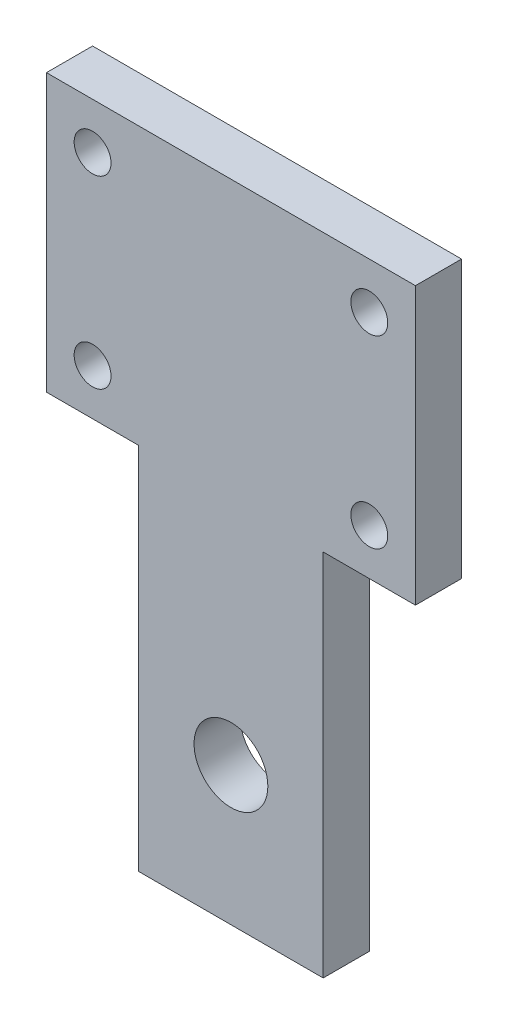
ISO-10303-21;
HEADER;
FILE_DESCRIPTION(('STEP AP214'),'2;1');
FILE_NAME('part.step','',(''),(''),'','','');
FILE_SCHEMA(('AUTOMOTIVE_DESIGN { 1 0 10303 214 1 1 1 1 }'));
ENDSEC;
DATA;
#1=APPLICATION_CONTEXT('core data for automotive mechanical design processes');
#2=APPLICATION_PROTOCOL_DEFINITION('international standard','automotive_design',2000,#1);
#3=PRODUCT_CONTEXT('',#1,'mechanical');
#4=PRODUCT('Part','Part','',(#3));
#5=PRODUCT_RELATED_PRODUCT_CATEGORY('part','',(#4));
#6=PRODUCT_DEFINITION_FORMATION('','',#4);
#7=PRODUCT_DEFINITION_CONTEXT('part definition',#1,'design');
#8=PRODUCT_DEFINITION('design','',#6,#7);
#9=PRODUCT_DEFINITION_SHAPE('','',#8);
#10=(LENGTH_UNIT() NAMED_UNIT(*) SI_UNIT(.MILLI.,.METRE.));
#11=(NAMED_UNIT(*) PLANE_ANGLE_UNIT() SI_UNIT($,.RADIAN.));
#12=(NAMED_UNIT(*) SI_UNIT($,.STERADIAN.) SOLID_ANGLE_UNIT());
#13=UNCERTAINTY_MEASURE_WITH_UNIT(LENGTH_MEASURE(1.E-05),#10,'distance_accuracy_value','');
#14=(GEOMETRIC_REPRESENTATION_CONTEXT(3) GLOBAL_UNCERTAINTY_ASSIGNED_CONTEXT((#13)) GLOBAL_UNIT_ASSIGNED_CONTEXT((#10,
#11,#12)) REPRESENTATION_CONTEXT('',''));
#15=CARTESIAN_POINT('',(0.,0.,0.));
#16=DIRECTION('',(0.,0.,1.));
#17=DIRECTION('',(1.,0.,0.));
#18=AXIS2_PLACEMENT_3D('',#15,#16,#17);
#19=CARTESIAN_POINT('',(20.,30.,2.5));
#20=DIRECTION('',(0.,-1.,0.));
#21=DIRECTION('',(1.,0.,0.));
#22=AXIS2_PLACEMENT_3D('',#19,#20,#21);
#23=PLANE('',#22);
#24=DIRECTION('',(-1.,0.,0.));
#25=VECTOR('',#24,1.);
#26=CARTESIAN_POINT('',(20.,30.,-2.5));
#27=LINE('',#26,#25);
#28=CARTESIAN_POINT('',(20.,30.,-2.5));
#29=VERTEX_POINT('',#28);
#30=CARTESIAN_POINT('',(-20.,30.,-2.5));
#31=VERTEX_POINT('',#30);
#32=EDGE_CURVE('E130',#29,#31,#27,.T.);
#33=ORIENTED_EDGE('',*,*,#32,.T.);
#34=DIRECTION('',(0.,0.,-1.));
#35=VECTOR('',#34,1.);
#36=CARTESIAN_POINT('',(-20.,30.,2.5));
#37=LINE('',#36,#35);
#38=CARTESIAN_POINT('',(-20.,30.,2.5));
#39=VERTEX_POINT('',#38);
#40=EDGE_CURVE('E11',#39,#31,#37,.T.);
#41=ORIENTED_EDGE('',*,*,#40,.F.);
#42=DIRECTION('',(-1.,0.,0.));
#43=VECTOR('',#42,1.);
#44=CARTESIAN_POINT('',(20.,30.,2.5));
#45=LINE('',#44,#43);
#46=CARTESIAN_POINT('',(20.,30.,2.5));
#47=VERTEX_POINT('',#46);
#48=EDGE_CURVE('E145',#47,#39,#45,.T.);
#49=ORIENTED_EDGE('',*,*,#48,.F.);
#50=DIRECTION('',(0.,0.,-1.));
#51=VECTOR('',#50,1.);
#52=CARTESIAN_POINT('',(20.,30.,2.5));
#53=LINE('',#52,#51);
#54=EDGE_CURVE('E126',#47,#29,#53,.T.);
#55=ORIENTED_EDGE('',*,*,#54,.T.);
#56=EDGE_LOOP('',(#33,#41,#49,#55));
#57=FACE_BOUND('',#56,.T.);
#58=ADVANCED_FACE('F32',(#57),#23,.F.);
#59=CARTESIAN_POINT('',(-20.,30.,2.5));
#60=DIRECTION('',(1.,0.,0.));
#61=DIRECTION('',(0.,1.,0.));
#62=AXIS2_PLACEMENT_3D('',#59,#60,#61);
#63=PLANE('',#62);
#64=DIRECTION('',(0.,-1.,0.));
#65=VECTOR('',#64,1.);
#66=CARTESIAN_POINT('',(-20.,30.,-2.5));
#67=LINE('',#66,#65);
#68=CARTESIAN_POINT('',(-20.,0.,-2.5));
#69=VERTEX_POINT('',#68);
#70=EDGE_CURVE('E133',#31,#69,#67,.T.);
#71=ORIENTED_EDGE('',*,*,#70,.T.);
#72=DIRECTION('',(0.,0.,-1.));
#73=VECTOR('',#72,1.);
#74=CARTESIAN_POINT('',(-20.,0.,2.5));
#75=LINE('',#74,#73);
#76=CARTESIAN_POINT('',(-20.,0.,2.5));
#77=VERTEX_POINT('',#76);
#78=EDGE_CURVE('E41',#77,#69,#75,.T.);
#79=ORIENTED_EDGE('',*,*,#78,.F.);
#80=DIRECTION('',(0.,-1.,0.));
#81=VECTOR('',#80,1.);
#82=CARTESIAN_POINT('',(-20.,30.,2.5));
#83=LINE('',#82,#81);
#84=EDGE_CURVE('E93',#39,#77,#83,.T.);
#85=ORIENTED_EDGE('',*,*,#84,.F.);
#86=ORIENTED_EDGE('',*,*,#40,.T.);
#87=EDGE_LOOP('',(#71,#79,#85,#86));
#88=FACE_BOUND('',#87,.T.);
#89=ADVANCED_FACE('F220',(#88),#63,.F.);
#90=CARTESIAN_POINT('',(-20.,0.,2.5));
#91=DIRECTION('',(0.,1.,0.));
#92=DIRECTION('',(-1.,0.,0.));
#93=AXIS2_PLACEMENT_3D('',#90,#91,#92);
#94=PLANE('',#93);
#95=DIRECTION('',(1.,0.,0.));
#96=VECTOR('',#95,1.);
#97=CARTESIAN_POINT('',(-20.,0.,-2.5));
#98=LINE('',#97,#96);
#99=CARTESIAN_POINT('',(-9.99999999999998,0.,-2.5));
#100=VERTEX_POINT('',#99);
#101=EDGE_CURVE('E136',#69,#100,#98,.T.);
#102=ORIENTED_EDGE('',*,*,#101,.T.);
#103=DIRECTION('',(0.,0.,-1.));
#104=VECTOR('',#103,1.);
#105=CARTESIAN_POINT('',(-9.99999999999998,0.,2.5));
#106=LINE('',#105,#104);
#107=CARTESIAN_POINT('',(-9.99999999999998,0.,2.5));
#108=VERTEX_POINT('',#107);
#109=EDGE_CURVE('E152',#108,#100,#106,.T.);
#110=ORIENTED_EDGE('',*,*,#109,.F.);
#111=DIRECTION('',(1.,0.,0.));
#112=VECTOR('',#111,1.);
#113=CARTESIAN_POINT('',(-20.,0.,2.5));
#114=LINE('',#113,#112);
#115=EDGE_CURVE('E188',#77,#108,#114,.T.);
#116=ORIENTED_EDGE('',*,*,#115,.F.);
#117=ORIENTED_EDGE('',*,*,#78,.T.);
#118=EDGE_LOOP('',(#102,#110,#116,#117));
#119=FACE_BOUND('',#118,.T.);
#120=ADVANCED_FACE('F224',(#119),#94,.F.);
#121=CARTESIAN_POINT('',(-9.99999999999998,0.,2.5));
#122=DIRECTION('',(1.,0.,0.));
#123=DIRECTION('',(0.,1.,0.));
#124=AXIS2_PLACEMENT_3D('',#121,#122,#123);
#125=PLANE('',#124);
#126=DIRECTION('',(0.,-1.,0.));
#127=VECTOR('',#126,1.);
#128=CARTESIAN_POINT('',(-9.99999999999998,0.,-2.5));
#129=LINE('',#128,#127);
#130=CARTESIAN_POINT('',(-9.99999999999999,-40.,-2.5));
#131=VERTEX_POINT('',#130);
#132=EDGE_CURVE('E138',#100,#131,#129,.T.);
#133=ORIENTED_EDGE('',*,*,#132,.T.);
#134=DIRECTION('',(0.,0.,-1.));
#135=VECTOR('',#134,1.);
#136=CARTESIAN_POINT('',(-9.99999999999999,-40.,2.5));
#137=LINE('',#136,#135);
#138=CARTESIAN_POINT('',(-9.99999999999999,-40.,2.5));
#139=VERTEX_POINT('',#138);
#140=EDGE_CURVE('E149',#139,#131,#137,.T.);
#141=ORIENTED_EDGE('',*,*,#140,.F.);
#142=DIRECTION('',(0.,-1.,0.));
#143=VECTOR('',#142,1.);
#144=CARTESIAN_POINT('',(-9.99999999999998,0.,2.5));
#145=LINE('',#144,#143);
#146=EDGE_CURVE('E190',#108,#139,#145,.T.);
#147=ORIENTED_EDGE('',*,*,#146,.F.);
#148=ORIENTED_EDGE('',*,*,#109,.T.);
#149=EDGE_LOOP('',(#133,#141,#147,#148));
#150=FACE_BOUND('',#149,.T.);
#151=ADVANCED_FACE('F196',(#150),#125,.F.);
#152=CARTESIAN_POINT('',(-9.99999999999999,-40.,2.5));
#153=DIRECTION('',(0.,1.,0.));
#154=DIRECTION('',(-1.,0.,0.));
#155=AXIS2_PLACEMENT_3D('',#152,#153,#154);
#156=PLANE('',#155);
#157=DIRECTION('',(1.,0.,0.));
#158=VECTOR('',#157,1.);
#159=CARTESIAN_POINT('',(-9.99999999999999,-40.,-2.5));
#160=LINE('',#159,#158);
#161=CARTESIAN_POINT('',(10.,-40.,-2.5));
#162=VERTEX_POINT('',#161);
#163=EDGE_CURVE('E140',#131,#162,#160,.T.);
#164=ORIENTED_EDGE('',*,*,#163,.T.);
#165=DIRECTION('',(0.,0.,-1.));
#166=VECTOR('',#165,1.);
#167=CARTESIAN_POINT('',(10.,-40.,2.5));
#168=LINE('',#167,#166);
#169=CARTESIAN_POINT('',(10.,-40.,2.5));
#170=VERTEX_POINT('',#169);
#171=EDGE_CURVE('E121',#170,#162,#168,.T.);
#172=ORIENTED_EDGE('',*,*,#171,.F.);
#173=DIRECTION('',(1.,0.,0.));
#174=VECTOR('',#173,1.);
#175=CARTESIAN_POINT('',(-9.99999999999999,-40.,2.5));
#176=LINE('',#175,#174);
#177=EDGE_CURVE('E112',#139,#170,#176,.T.);
#178=ORIENTED_EDGE('',*,*,#177,.F.);
#179=ORIENTED_EDGE('',*,*,#140,.T.);
#180=EDGE_LOOP('',(#164,#172,#178,#179));
#181=FACE_BOUND('',#180,.T.);
#182=ADVANCED_FACE('F200',(#181),#156,.F.);
#183=CARTESIAN_POINT('',(10.,-40.,2.5));
#184=DIRECTION('',(-1.,0.,0.));
#185=DIRECTION('',(0.,-1.,0.));
#186=AXIS2_PLACEMENT_3D('',#183,#184,#185);
#187=PLANE('',#186);
#188=DIRECTION('',(0.,1.,0.));
#189=VECTOR('',#188,1.);
#190=CARTESIAN_POINT('',(10.,-40.,-2.5));
#191=LINE('',#190,#189);
#192=CARTESIAN_POINT('',(9.99999999999998,0.,-2.5));
#193=VERTEX_POINT('',#192);
#194=EDGE_CURVE('E120',#162,#193,#191,.T.);
#195=ORIENTED_EDGE('',*,*,#194,.T.);
#196=DIRECTION('',(0.,0.,-1.));
#197=VECTOR('',#196,1.);
#198=CARTESIAN_POINT('',(9.99999999999998,0.,2.5));
#199=LINE('',#198,#197);
#200=CARTESIAN_POINT('',(9.99999999999998,0.,2.5));
#201=VERTEX_POINT('',#200);
#202=EDGE_CURVE('E117',#201,#193,#199,.T.);
#203=ORIENTED_EDGE('',*,*,#202,.F.);
#204=DIRECTION('',(0.,1.,0.));
#205=VECTOR('',#204,1.);
#206=CARTESIAN_POINT('',(10.,-40.,2.5));
#207=LINE('',#206,#205);
#208=EDGE_CURVE('E106',#170,#201,#207,.T.);
#209=ORIENTED_EDGE('',*,*,#208,.F.);
#210=ORIENTED_EDGE('',*,*,#171,.T.);
#211=EDGE_LOOP('',(#195,#203,#209,#210));
#212=FACE_BOUND('',#211,.T.);
#213=ADVANCED_FACE('F118',(#212),#187,.F.);
#214=CARTESIAN_POINT('',(9.99999999999998,0.,2.5));
#215=DIRECTION('',(0.,1.,0.));
#216=DIRECTION('',(-1.,0.,0.));
#217=AXIS2_PLACEMENT_3D('',#214,#215,#216);
#218=PLANE('',#217);
#219=DIRECTION('',(1.,0.,0.));
#220=VECTOR('',#219,1.);
#221=CARTESIAN_POINT('',(9.99999999999998,0.,-2.5));
#222=LINE('',#221,#220);
#223=CARTESIAN_POINT('',(20.,0.,-2.5));
#224=VERTEX_POINT('',#223);
#225=EDGE_CURVE('E79',#193,#224,#222,.T.);
#226=ORIENTED_EDGE('',*,*,#225,.T.);
#227=DIRECTION('',(0.,0.,-1.));
#228=VECTOR('',#227,1.);
#229=CARTESIAN_POINT('',(20.,0.,2.5));
#230=LINE('',#229,#228);
#231=CARTESIAN_POINT('',(20.,0.,2.5));
#232=VERTEX_POINT('',#231);
#233=EDGE_CURVE('E122',#232,#224,#230,.T.);
#234=ORIENTED_EDGE('',*,*,#233,.F.);
#235=DIRECTION('',(1.,0.,0.));
#236=VECTOR('',#235,1.);
#237=CARTESIAN_POINT('',(9.99999999999998,0.,2.5));
#238=LINE('',#237,#236);
#239=EDGE_CURVE('E110',#201,#232,#238,.T.);
#240=ORIENTED_EDGE('',*,*,#239,.F.);
#241=ORIENTED_EDGE('',*,*,#202,.T.);
#242=EDGE_LOOP('',(#226,#234,#240,#241));
#243=FACE_BOUND('',#242,.T.);
#244=ADVANCED_FACE('F124',(#243),#218,.F.);
#245=CARTESIAN_POINT('',(20.,0.,2.5));
#246=DIRECTION('',(-1.,0.,0.));
#247=DIRECTION('',(0.,-1.,0.));
#248=AXIS2_PLACEMENT_3D('',#245,#246,#247);
#249=PLANE('',#248);
#250=DIRECTION('',(0.,1.,0.));
#251=VECTOR('',#250,1.);
#252=CARTESIAN_POINT('',(20.,0.,-2.5));
#253=LINE('',#252,#251);
#254=EDGE_CURVE('E85',#224,#29,#253,.T.);
#255=ORIENTED_EDGE('',*,*,#254,.T.);
#256=ORIENTED_EDGE('',*,*,#54,.F.);
#257=DIRECTION('',(0.,1.,0.));
#258=VECTOR('',#257,1.);
#259=CARTESIAN_POINT('',(20.,0.,2.5));
#260=LINE('',#259,#258);
#261=EDGE_CURVE('E50',#232,#47,#260,.T.);
#262=ORIENTED_EDGE('',*,*,#261,.F.);
#263=ORIENTED_EDGE('',*,*,#233,.T.);
#264=EDGE_LOOP('',(#255,#256,#262,#263));
#265=FACE_BOUND('',#264,.T.);
#266=ADVANCED_FACE('F208',(#265),#249,.F.);
#267=CARTESIAN_POINT('',(0.,0.,2.5));
#268=DIRECTION('',(0.,0.,1.));
#269=DIRECTION('',(1.,0.,0.));
#270=AXIS2_PLACEMENT_3D('',#267,#268,#269);
#271=PLANE('',#270);
#272=CARTESIAN_POINT('',(-15.,5.,2.5));
#273=DIRECTION('',(0.,0.,1.));
#274=DIRECTION('',(1.,0.,0.));
#275=AXIS2_PLACEMENT_3D('',#272,#273,#274);
#276=CIRCLE('',#275,2.);
#277=CARTESIAN_POINT('',(-13.,5.,2.5));
#278=VERTEX_POINT('',#277);
#279=EDGE_CURVE('E177',#278,#278,#276,.T.);
#280=ORIENTED_EDGE('',*,*,#279,.F.);
#281=EDGE_LOOP('',(#280));
#282=FACE_BOUND('',#281,.T.);
#283=CARTESIAN_POINT('',(15.,5.,2.5));
#284=DIRECTION('',(0.,0.,1.));
#285=DIRECTION('',(1.,0.,0.));
#286=AXIS2_PLACEMENT_3D('',#283,#284,#285);
#287=CIRCLE('',#286,2.00000000000001);
#288=CARTESIAN_POINT('',(17.,5.,2.5));
#289=VERTEX_POINT('',#288);
#290=EDGE_CURVE('E167',#289,#289,#287,.T.);
#291=ORIENTED_EDGE('',*,*,#290,.F.);
#292=EDGE_LOOP('',(#291));
#293=FACE_BOUND('',#292,.T.);
#294=CARTESIAN_POINT('',(15.,25.,2.5));
#295=DIRECTION('',(0.,0.,1.));
#296=DIRECTION('',(1.,0.,0.));
#297=AXIS2_PLACEMENT_3D('',#294,#295,#296);
#298=CIRCLE('',#297,2.00000000000001);
#299=CARTESIAN_POINT('',(17.,25.,2.5));
#300=VERTEX_POINT('',#299);
#301=EDGE_CURVE('E164',#300,#300,#298,.T.);
#302=ORIENTED_EDGE('',*,*,#301,.F.);
#303=EDGE_LOOP('',(#302));
#304=FACE_BOUND('',#303,.T.);
#305=CARTESIAN_POINT('',(-15.,25.,2.5));
#306=DIRECTION('',(0.,0.,1.));
#307=DIRECTION('',(1.,0.,0.));
#308=AXIS2_PLACEMENT_3D('',#305,#306,#307);
#309=CIRCLE('',#308,2.);
#310=CARTESIAN_POINT('',(-13.,25.,2.5));
#311=VERTEX_POINT('',#310);
#312=EDGE_CURVE('E161',#311,#311,#309,.T.);
#313=ORIENTED_EDGE('',*,*,#312,.F.);
#314=EDGE_LOOP('',(#313));
#315=FACE_BOUND('',#314,.T.);
#316=CARTESIAN_POINT('',(0.,-25.,2.5));
#317=DIRECTION('',(0.,0.,1.));
#318=DIRECTION('',(1.,0.,0.));
#319=AXIS2_PLACEMENT_3D('',#316,#317,#318);
#320=CIRCLE('',#319,4.);
#321=CARTESIAN_POINT('',(4.,-25.,2.5));
#322=VERTEX_POINT('',#321);
#323=EDGE_CURVE('E160',#322,#322,#320,.T.);
#324=ORIENTED_EDGE('',*,*,#323,.F.);
#325=EDGE_LOOP('',(#324));
#326=FACE_BOUND('',#325,.T.);
#327=ORIENTED_EDGE('',*,*,#48,.T.);
#328=ORIENTED_EDGE('',*,*,#84,.T.);
#329=ORIENTED_EDGE('',*,*,#115,.T.);
#330=ORIENTED_EDGE('',*,*,#146,.T.);
#331=ORIENTED_EDGE('',*,*,#177,.T.);
#332=ORIENTED_EDGE('',*,*,#208,.T.);
#333=ORIENTED_EDGE('',*,*,#239,.T.);
#334=ORIENTED_EDGE('',*,*,#261,.T.);
#335=EDGE_LOOP('',(#327,#328,#329,#330,#331,#332,#333,#334));
#336=FACE_BOUND('',#335,.T.);
#337=ADVANCED_FACE('F108',(#282,#293,#304,#315,#326,#336),#271,.T.);
#338=CARTESIAN_POINT('',(0.,0.,-2.5));
#339=DIRECTION('',(0.,0.,1.));
#340=DIRECTION('',(1.,0.,0.));
#341=AXIS2_PLACEMENT_3D('',#338,#339,#340);
#342=PLANE('',#341);
#343=CARTESIAN_POINT('',(-15.,5.,-2.5));
#344=DIRECTION('',(0.,0.,1.));
#345=DIRECTION('',(1.,0.,0.));
#346=AXIS2_PLACEMENT_3D('',#343,#344,#345);
#347=CIRCLE('',#346,2.);
#348=CARTESIAN_POINT('',(-13.,5.,-2.5));
#349=VERTEX_POINT('',#348);
#350=EDGE_CURVE('E35',#349,#349,#347,.T.);
#351=ORIENTED_EDGE('',*,*,#350,.T.);
#352=EDGE_LOOP('',(#351));
#353=FACE_BOUND('',#352,.T.);
#354=CARTESIAN_POINT('',(15.,5.,-2.5));
#355=DIRECTION('',(0.,0.,1.));
#356=DIRECTION('',(1.,0.,0.));
#357=AXIS2_PLACEMENT_3D('',#354,#355,#356);
#358=CIRCLE('',#357,2.00000000000001);
#359=CARTESIAN_POINT('',(17.,5.,-2.5));
#360=VERTEX_POINT('',#359);
#361=EDGE_CURVE('E165',#360,#360,#358,.T.);
#362=ORIENTED_EDGE('',*,*,#361,.T.);
#363=EDGE_LOOP('',(#362));
#364=FACE_BOUND('',#363,.T.);
#365=CARTESIAN_POINT('',(15.,25.,-2.5));
#366=DIRECTION('',(0.,0.,1.));
#367=DIRECTION('',(1.,0.,0.));
#368=AXIS2_PLACEMENT_3D('',#365,#366,#367);
#369=CIRCLE('',#368,2.00000000000001);
#370=CARTESIAN_POINT('',(17.,25.,-2.5));
#371=VERTEX_POINT('',#370);
#372=EDGE_CURVE('E162',#371,#371,#369,.T.);
#373=ORIENTED_EDGE('',*,*,#372,.T.);
#374=EDGE_LOOP('',(#373));
#375=FACE_BOUND('',#374,.T.);
#376=CARTESIAN_POINT('',(-15.,25.,-2.5));
#377=DIRECTION('',(0.,0.,1.));
#378=DIRECTION('',(1.,0.,0.));
#379=AXIS2_PLACEMENT_3D('',#376,#377,#378);
#380=CIRCLE('',#379,2.);
#381=CARTESIAN_POINT('',(-13.,25.,-2.5));
#382=VERTEX_POINT('',#381);
#383=EDGE_CURVE('E157',#382,#382,#380,.T.);
#384=ORIENTED_EDGE('',*,*,#383,.T.);
#385=EDGE_LOOP('',(#384));
#386=FACE_BOUND('',#385,.T.);
#387=CARTESIAN_POINT('',(0.,-25.,-2.5));
#388=DIRECTION('',(0.,0.,1.));
#389=DIRECTION('',(1.,0.,0.));
#390=AXIS2_PLACEMENT_3D('',#387,#388,#389);
#391=CIRCLE('',#390,4.);
#392=CARTESIAN_POINT('',(4.,-25.,-2.5));
#393=VERTEX_POINT('',#392);
#394=EDGE_CURVE('E134',#393,#393,#391,.T.);
#395=ORIENTED_EDGE('',*,*,#394,.T.);
#396=EDGE_LOOP('',(#395));
#397=FACE_BOUND('',#396,.T.);
#398=ORIENTED_EDGE('',*,*,#32,.F.);
#399=ORIENTED_EDGE('',*,*,#254,.F.);
#400=ORIENTED_EDGE('',*,*,#225,.F.);
#401=ORIENTED_EDGE('',*,*,#194,.F.);
#402=ORIENTED_EDGE('',*,*,#163,.F.);
#403=ORIENTED_EDGE('',*,*,#132,.F.);
#404=ORIENTED_EDGE('',*,*,#101,.F.);
#405=ORIENTED_EDGE('',*,*,#70,.F.);
#406=EDGE_LOOP('',(#398,#399,#400,#401,#402,#403,#404,#405));
#407=FACE_BOUND('',#406,.T.);
#408=ADVANCED_FACE('F203',(#353,#364,#375,#386,#397,#407),#342,.F.);
#409=CARTESIAN_POINT('',(0.,-25.,-2.5));
#410=DIRECTION('',(0.,0.,1.));
#411=DIRECTION('',(1.,0.,0.));
#412=AXIS2_PLACEMENT_3D('',#409,#410,#411);
#413=CYLINDRICAL_SURFACE('',#412,4.);
#414=ORIENTED_EDGE('',*,*,#394,.F.);
#415=EDGE_LOOP('',(#414));
#416=FACE_BOUND('',#415,.T.);
#417=ORIENTED_EDGE('',*,*,#323,.T.);
#418=EDGE_LOOP('',(#417));
#419=FACE_BOUND('',#418,.T.);
#420=ADVANCED_FACE('F254',(#416,#419),#413,.F.);
#421=CARTESIAN_POINT('',(-15.,25.,-7.5));
#422=DIRECTION('',(0.,0.,1.));
#423=DIRECTION('',(1.,0.,0.));
#424=AXIS2_PLACEMENT_3D('',#421,#422,#423);
#425=CYLINDRICAL_SURFACE('',#424,2.);
#426=ORIENTED_EDGE('',*,*,#312,.T.);
#427=EDGE_LOOP('',(#426));
#428=FACE_BOUND('',#427,.T.);
#429=ORIENTED_EDGE('',*,*,#383,.F.);
#430=EDGE_LOOP('',(#429));
#431=FACE_BOUND('',#430,.T.);
#432=ADVANCED_FACE('F259',(#428,#431),#425,.F.);
#433=CARTESIAN_POINT('',(15.,25.,-7.5));
#434=DIRECTION('',(0.,0.,1.));
#435=DIRECTION('',(1.,0.,0.));
#436=AXIS2_PLACEMENT_3D('',#433,#434,#435);
#437=CYLINDRICAL_SURFACE('',#436,2.00000000000001);
#438=ORIENTED_EDGE('',*,*,#301,.T.);
#439=EDGE_LOOP('',(#438));
#440=FACE_BOUND('',#439,.T.);
#441=ORIENTED_EDGE('',*,*,#372,.F.);
#442=EDGE_LOOP('',(#441));
#443=FACE_BOUND('',#442,.T.);
#444=ADVANCED_FACE('F282',(#440,#443),#437,.F.);
#445=CARTESIAN_POINT('',(15.,5.,-7.5));
#446=DIRECTION('',(0.,0.,1.));
#447=DIRECTION('',(1.,0.,0.));
#448=AXIS2_PLACEMENT_3D('',#445,#446,#447);
#449=CYLINDRICAL_SURFACE('',#448,2.00000000000001);
#450=ORIENTED_EDGE('',*,*,#290,.T.);
#451=EDGE_LOOP('',(#450));
#452=FACE_BOUND('',#451,.T.);
#453=ORIENTED_EDGE('',*,*,#361,.F.);
#454=EDGE_LOOP('',(#453));
#455=FACE_BOUND('',#454,.T.);
#456=ADVANCED_FACE('F292',(#452,#455),#449,.F.);
#457=CARTESIAN_POINT('',(-15.,5.,-7.5));
#458=DIRECTION('',(0.,0.,1.));
#459=DIRECTION('',(1.,0.,0.));
#460=AXIS2_PLACEMENT_3D('',#457,#458,#459);
#461=CYLINDRICAL_SURFACE('',#460,2.);
#462=ORIENTED_EDGE('',*,*,#279,.T.);
#463=EDGE_LOOP('',(#462));
#464=FACE_BOUND('',#463,.T.);
#465=ORIENTED_EDGE('',*,*,#350,.F.);
#466=EDGE_LOOP('',(#465));
#467=FACE_BOUND('',#466,.T.);
#468=ADVANCED_FACE('F302',(#464,#467),#461,.F.);
#469=CLOSED_SHELL('',(#58,#89,#120,#151,#182,#213,#244,#266,#337,#408,#420,#432,#444,#456,#468));
#470=MANIFOLD_SOLID_BREP('B2',#469);
#471=ADVANCED_BREP_SHAPE_REPRESENTATION('',(#18,#470),#14);
#472=SHAPE_DEFINITION_REPRESENTATION(#9,#471);
ENDSEC;
END-ISO-10303-21;
